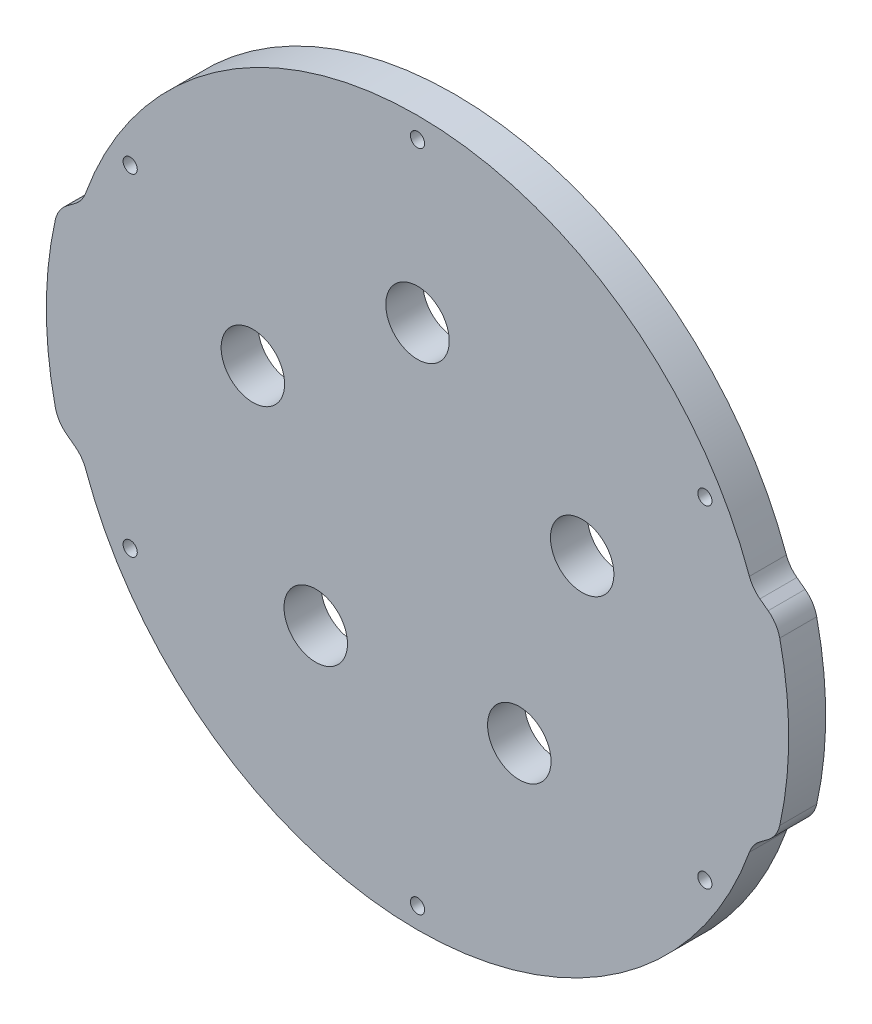
ISO-10303-21;
HEADER;
FILE_DESCRIPTION(('STEP AP214'),'2;1');
FILE_NAME('part.step','',(''),(''),'','','');
FILE_SCHEMA(('AUTOMOTIVE_DESIGN { 1 0 10303 214 1 1 1 1 }'));
ENDSEC;
DATA;
#1=APPLICATION_CONTEXT('core data for automotive mechanical design processes');
#2=APPLICATION_PROTOCOL_DEFINITION('international standard','automotive_design',2000,#1);
#3=PRODUCT_CONTEXT('',#1,'mechanical');
#4=PRODUCT('Part','Part','',(#3));
#5=PRODUCT_RELATED_PRODUCT_CATEGORY('part','',(#4));
#6=PRODUCT_DEFINITION_FORMATION('','',#4);
#7=PRODUCT_DEFINITION_CONTEXT('part definition',#1,'design');
#8=PRODUCT_DEFINITION('design','',#6,#7);
#9=PRODUCT_DEFINITION_SHAPE('','',#8);
#10=(LENGTH_UNIT() NAMED_UNIT(*) SI_UNIT(.MILLI.,.METRE.));
#11=(NAMED_UNIT(*) PLANE_ANGLE_UNIT() SI_UNIT($,.RADIAN.));
#12=(NAMED_UNIT(*) SI_UNIT($,.STERADIAN.) SOLID_ANGLE_UNIT());
#13=UNCERTAINTY_MEASURE_WITH_UNIT(LENGTH_MEASURE(1.E-05),#10,'distance_accuracy_value','');
#14=(GEOMETRIC_REPRESENTATION_CONTEXT(3) GLOBAL_UNCERTAINTY_ASSIGNED_CONTEXT((#13)) GLOBAL_UNIT_ASSIGNED_CONTEXT((#10,
#11,#12)) REPRESENTATION_CONTEXT('',''));
#15=CARTESIAN_POINT('',(0.,0.,0.));
#16=DIRECTION('',(0.,0.,1.));
#17=DIRECTION('',(1.,0.,0.));
#18=AXIS2_PLACEMENT_3D('',#15,#16,#17);
#19=CARTESIAN_POINT('',(0.,0.,5.99999999999999));
#20=DIRECTION('',(0.,0.,1.));
#21=DIRECTION('',(1.,0.,0.));
#22=AXIS2_PLACEMENT_3D('',#19,#20,#21);
#23=PLANE('',#22);
#24=CARTESIAN_POINT('',(-26.7246881078937,8.68337754193633,5.99999999999999));
#25=DIRECTION('',(0.,0.,1.));
#26=DIRECTION('',(1.,0.,0.));
#27=AXIS2_PLACEMENT_3D('',#24,#25,#26);
#28=CIRCLE('',#27,5.15);
#29=CARTESIAN_POINT('',(-21.5746881078937,8.68337754193633,5.99999999999999));
#30=VERTEX_POINT('',#29);
#31=EDGE_CURVE('E354',#30,#30,#28,.T.);
#32=ORIENTED_EDGE('',*,*,#31,.F.);
#33=EDGE_LOOP('',(#32));
#34=FACE_BOUND('',#33,.T.);
#35=CARTESIAN_POINT('',(26.7246881078937,8.68337754193633,5.99999999999999));
#36=DIRECTION('',(0.,0.,1.));
#37=DIRECTION('',(1.,0.,0.));
#38=AXIS2_PLACEMENT_3D('',#35,#36,#37);
#39=CIRCLE('',#38,5.15);
#40=CARTESIAN_POINT('',(31.8746881078937,8.68337754193633,5.99999999999999));
#41=VERTEX_POINT('',#40);
#42=EDGE_CURVE('E348',#41,#41,#39,.T.);
#43=ORIENTED_EDGE('',*,*,#42,.F.);
#44=EDGE_LOOP('',(#43));
#45=FACE_BOUND('',#44,.T.);
#46=CARTESIAN_POINT('',(16.5167655894193,-22.7333775419354,5.99999999999999));
#47=DIRECTION('',(0.,0.,1.));
#48=DIRECTION('',(1.,0.,0.));
#49=AXIS2_PLACEMENT_3D('',#46,#47,#48);
#50=CIRCLE('',#49,5.15000000000171);
#51=CARTESIAN_POINT('',(21.666765589421,-22.7333775419354,5.99999999999999));
#52=VERTEX_POINT('',#51);
#53=EDGE_CURVE('E342',#52,#52,#50,.T.);
#54=ORIENTED_EDGE('',*,*,#53,.F.);
#55=EDGE_LOOP('',(#54));
#56=FACE_BOUND('',#55,.T.);
#57=CARTESIAN_POINT('',(-16.5167655894176,-22.7333775419357,5.99999999999999));
#58=DIRECTION('',(0.,0.,1.));
#59=DIRECTION('',(1.,0.,0.));
#60=AXIS2_PLACEMENT_3D('',#57,#58,#59);
#61=CIRCLE('',#60,5.15000000000128);
#62=CARTESIAN_POINT('',(-11.3667655894163,-22.7333775419357,5.99999999999999));
#63=VERTEX_POINT('',#62);
#64=EDGE_CURVE('E336',#63,#63,#61,.T.);
#65=ORIENTED_EDGE('',*,*,#64,.F.);
#66=EDGE_LOOP('',(#65));
#67=FACE_BOUND('',#66,.T.);
#68=CARTESIAN_POINT('',(0.,28.1,5.99999999999999));
#69=DIRECTION('',(0.,0.,1.));
#70=DIRECTION('',(1.,0.,0.));
#71=AXIS2_PLACEMENT_3D('',#68,#69,#70);
#72=CIRCLE('',#71,5.15);
#73=CARTESIAN_POINT('',(5.15,28.1,5.99999999999999));
#74=VERTEX_POINT('',#73);
#75=EDGE_CURVE('E330',#74,#74,#72,.T.);
#76=ORIENTED_EDGE('',*,*,#75,.F.);
#77=EDGE_LOOP('',(#76));
#78=FACE_BOUND('',#77,.T.);
#79=CARTESIAN_POINT('',(-46.6354679937874,-26.9250000000027,5.99999999999999));
#80=DIRECTION('',(0.,0.,1.));
#81=DIRECTION('',(1.,0.,0.));
#82=AXIS2_PLACEMENT_3D('',#79,#80,#81);
#83=CIRCLE('',#82,1.15000000000566);
#84=CARTESIAN_POINT('',(-45.4854679937818,-26.9250000000027,5.99999999999999));
#85=VERTEX_POINT('',#84);
#86=EDGE_CURVE('E315',#85,#85,#83,.T.);
#87=ORIENTED_EDGE('',*,*,#86,.F.);
#88=EDGE_LOOP('',(#87));
#89=FACE_BOUND('',#88,.T.);
#90=CARTESIAN_POINT('',(46.6354679937966,-26.9249999999973,5.99999999999999));
#91=DIRECTION('',(0.,0.,1.));
#92=DIRECTION('',(1.,0.,0.));
#93=AXIS2_PLACEMENT_3D('',#90,#91,#92);
#94=CIRCLE('',#93,1.15000000000386);
#95=CARTESIAN_POINT('',(47.7854679938005,-26.9249999999973,5.99999999999999));
#96=VERTEX_POINT('',#95);
#97=EDGE_CURVE('E303',#96,#96,#94,.T.);
#98=ORIENTED_EDGE('',*,*,#97,.F.);
#99=EDGE_LOOP('',(#98));
#100=FACE_BOUND('',#99,.T.);
#101=CARTESIAN_POINT('',(0.,53.85,5.99999999999999));
#102=DIRECTION('',(0.,0.,1.));
#103=DIRECTION('',(1.,0.,0.));
#104=AXIS2_PLACEMENT_3D('',#101,#102,#103);
#105=CIRCLE('',#104,1.15);
#106=CARTESIAN_POINT('',(1.15,53.85,5.99999999999999));
#107=VERTEX_POINT('',#106);
#108=EDGE_CURVE('E273',#107,#107,#105,.T.);
#109=ORIENTED_EDGE('',*,*,#108,.F.);
#110=EDGE_LOOP('',(#109));
#111=FACE_BOUND('',#110,.T.);
#112=DIRECTION('',(-0.800447556206134,-0.599402794257441,0.));
#113=VECTOR('',#112,1.);
#114=CARTESIAN_POINT('',(-58.3529133805674,15.,5.99999999999999));
#115=LINE('',#114,#113);
#116=CARTESIAN_POINT('',(-55.5739785892829,17.0809624141399,5.99999999999999));
#117=VERTEX_POINT('',#116);
#118=CARTESIAN_POINT('',(-56.9107570593107,16.0799364955455,5.99999999999999));
#119=VERTEX_POINT('',#118);
#120=EDGE_CURVE('E166',#117,#119,#115,.T.);
#121=ORIENTED_EDGE('',*,*,#120,.T.);
#122=CARTESIAN_POINT('',(-53.9137430880235,12.0776987145149,5.99999999999999));
#123=DIRECTION('',(0.,0.,1.));
#124=DIRECTION('',(1.,0.,0.));
#125=AXIS2_PLACEMENT_3D('',#122,#123,#124);
#126=CIRCLE('',#125,5.);
#127=CARTESIAN_POINT('',(-58.7928148606954,13.1707031230683,5.99999999999999));
#128=VERTEX_POINT('',#127);
#129=EDGE_CURVE('E208',#119,#128,#126,.T.);
#130=ORIENTED_EDGE('',*,*,#129,.T.);
#131=CARTESIAN_POINT('',(0.,0.,5.99999999999999));
#132=DIRECTION('',(0.,0.,1.));
#133=DIRECTION('',(1.,0.,0.));
#134=AXIS2_PLACEMENT_3D('',#131,#132,#133);
#135=CIRCLE('',#134,60.25);
#136=CARTESIAN_POINT('',(-58.7928148606953,-13.1707031230683,5.99999999999999));
#137=VERTEX_POINT('',#136);
#138=EDGE_CURVE('E261',#128,#137,#135,.T.);
#139=ORIENTED_EDGE('',*,*,#138,.T.);
#140=CARTESIAN_POINT('',(-53.9137430880235,-12.0776987145149,5.99999999999999));
#141=DIRECTION('',(0.,0.,1.));
#142=DIRECTION('',(1.,0.,0.));
#143=AXIS2_PLACEMENT_3D('',#140,#141,#142);
#144=CIRCLE('',#143,5.);
#145=CARTESIAN_POINT('',(-56.9107570593107,-16.0799364955456,5.99999999999999));
#146=VERTEX_POINT('',#145);
#147=EDGE_CURVE('E54',#137,#146,#144,.T.);
#148=ORIENTED_EDGE('',*,*,#147,.T.);
#149=DIRECTION('',(0.800447556206134,-0.599402794257441,0.));
#150=VECTOR('',#149,1.);
#151=CARTESIAN_POINT('',(-58.3529133805674,-15.,5.99999999999999));
#152=LINE('',#151,#150);
#153=CARTESIAN_POINT('',(-55.5739785892829,-17.08096241414,5.99999999999999));
#154=VERTEX_POINT('',#153);
#155=EDGE_CURVE('E186',#146,#154,#152,.T.);
#156=ORIENTED_EDGE('',*,*,#155,.T.);
#157=CARTESIAN_POINT('',(-58.5709925605701,-21.0832001951707,5.99999999999999));
#158=DIRECTION('',(0.,0.,1.));
#159=DIRECTION('',(1.,0.,0.));
#160=AXIS2_PLACEMENT_3D('',#157,#158,#159);
#161=CIRCLE('',#160,5.);
#162=CARTESIAN_POINT('',(-53.8664951661468,-19.3897704606188,5.99999999999999));
#163=VERTEX_POINT('',#162);
#164=EDGE_CURVE('E236',#154,#163,#161,.F.);
#165=ORIENTED_EDGE('',*,*,#164,.T.);
#166=CARTESIAN_POINT('',(0.,0.,5.99999999999999));
#167=DIRECTION('',(0.,0.,1.));
#168=DIRECTION('',(1.,0.,0.));
#169=AXIS2_PLACEMENT_3D('',#166,#167,#168);
#170=CIRCLE('',#169,57.25);
#171=CARTESIAN_POINT('',(53.8664951661468,-19.3897704606188,5.99999999999999));
#172=VERTEX_POINT('',#171);
#173=EDGE_CURVE('E185',#163,#172,#170,.T.);
#174=ORIENTED_EDGE('',*,*,#173,.T.);
#175=CARTESIAN_POINT('',(58.5709925605701,-21.0832001951706,5.99999999999999));
#176=DIRECTION('',(0.,0.,1.));
#177=DIRECTION('',(1.,0.,0.));
#178=AXIS2_PLACEMENT_3D('',#175,#176,#177);
#179=CIRCLE('',#178,5.);
#180=CARTESIAN_POINT('',(55.5739785892829,-17.0809624141399,5.99999999999999));
#181=VERTEX_POINT('',#180);
#182=EDGE_CURVE('E240',#172,#181,#179,.F.);
#183=ORIENTED_EDGE('',*,*,#182,.T.);
#184=DIRECTION('',(0.800447556206134,0.599402794257441,0.));
#185=VECTOR('',#184,1.);
#186=CARTESIAN_POINT('',(54.3466880315627,-18.,5.99999999999999));
#187=LINE('',#186,#185);
#188=CARTESIAN_POINT('',(56.9107570593107,-16.0799364955456,5.99999999999999));
#189=VERTEX_POINT('',#188);
#190=EDGE_CURVE('E289',#181,#189,#187,.T.);
#191=ORIENTED_EDGE('',*,*,#190,.T.);
#192=CARTESIAN_POINT('',(53.9137430880235,-12.0776987145149,5.99999999999999));
#193=DIRECTION('',(0.,0.,1.));
#194=DIRECTION('',(1.,0.,0.));
#195=AXIS2_PLACEMENT_3D('',#192,#193,#194);
#196=CIRCLE('',#195,5.);
#197=CARTESIAN_POINT('',(58.7928148606953,-13.1707031230683,5.99999999999999));
#198=VERTEX_POINT('',#197);
#199=EDGE_CURVE('E205',#189,#198,#196,.T.);
#200=ORIENTED_EDGE('',*,*,#199,.T.);
#201=CARTESIAN_POINT('',(0.,0.,5.99999999999999));
#202=DIRECTION('',(0.,0.,1.));
#203=DIRECTION('',(-1.,0.,0.));
#204=AXIS2_PLACEMENT_3D('',#201,#202,#203);
#205=CIRCLE('',#204,60.2500000000001);
#206=CARTESIAN_POINT('',(58.7928148606953,13.1707031230683,5.99999999999999));
#207=VERTEX_POINT('',#206);
#208=EDGE_CURVE('E263',#198,#207,#205,.T.);
#209=ORIENTED_EDGE('',*,*,#208,.T.);
#210=CARTESIAN_POINT('',(53.9137430880235,12.0776987145149,5.99999999999999));
#211=DIRECTION('',(0.,0.,1.));
#212=DIRECTION('',(1.,0.,0.));
#213=AXIS2_PLACEMENT_3D('',#210,#211,#212);
#214=CIRCLE('',#213,5.);
#215=CARTESIAN_POINT('',(56.9107570593107,16.0799364955455,5.99999999999999));
#216=VERTEX_POINT('',#215);
#217=EDGE_CURVE('E203',#207,#216,#214,.T.);
#218=ORIENTED_EDGE('',*,*,#217,.T.);
#219=DIRECTION('',(-0.800447556206134,0.599402794257441,0.));
#220=VECTOR('',#219,1.);
#221=CARTESIAN_POINT('',(58.3529133805674,15.,5.99999999999999));
#222=LINE('',#221,#220);
#223=CARTESIAN_POINT('',(55.5739785892829,17.0809624141399,5.99999999999999));
#224=VERTEX_POINT('',#223);
#225=EDGE_CURVE('E257',#216,#224,#222,.T.);
#226=ORIENTED_EDGE('',*,*,#225,.T.);
#227=CARTESIAN_POINT('',(58.5709925605701,21.0832001951706,5.99999999999999));
#228=DIRECTION('',(0.,0.,1.));
#229=DIRECTION('',(1.,0.,0.));
#230=AXIS2_PLACEMENT_3D('',#227,#228,#229);
#231=CIRCLE('',#230,5.);
#232=CARTESIAN_POINT('',(53.8664951661468,19.3897704606188,5.99999999999999));
#233=VERTEX_POINT('',#232);
#234=EDGE_CURVE('E11',#224,#233,#231,.F.);
#235=ORIENTED_EDGE('',*,*,#234,.T.);
#236=CARTESIAN_POINT('',(0.,0.,5.99999999999999));
#237=DIRECTION('',(0.,0.,1.));
#238=DIRECTION('',(-1.,0.,0.));
#239=AXIS2_PLACEMENT_3D('',#236,#237,#238);
#240=CIRCLE('',#239,57.25);
#241=CARTESIAN_POINT('',(-53.8664951661468,19.3897704606188,5.99999999999999));
#242=VERTEX_POINT('',#241);
#243=EDGE_CURVE('E256',#233,#242,#240,.T.);
#244=ORIENTED_EDGE('',*,*,#243,.T.);
#245=CARTESIAN_POINT('',(-58.5709925605701,21.0832001951706,5.99999999999999));
#246=DIRECTION('',(0.,0.,1.));
#247=DIRECTION('',(1.,0.,0.));
#248=AXIS2_PLACEMENT_3D('',#245,#246,#247);
#249=CIRCLE('',#248,5.);
#250=EDGE_CURVE('E156',#242,#117,#249,.F.);
#251=ORIENTED_EDGE('',*,*,#250,.T.);
#252=EDGE_LOOP('',(#121,#130,#139,#148,#156,#165,#174,#183,#191,#200,#209,#218,#226,#235,#244,#251));
#253=FACE_BOUND('',#252,.T.);
#254=CARTESIAN_POINT('',(46.6354679937935,26.9250000000027,5.99999999999999));
#255=DIRECTION('',(0.,0.,1.));
#256=DIRECTION('',(1.,0.,0.));
#257=AXIS2_PLACEMENT_3D('',#254,#255,#256);
#258=CIRCLE('',#257,1.15000000000082);
#259=CARTESIAN_POINT('',(47.7854679937944,26.9250000000027,5.99999999999999));
#260=VERTEX_POINT('',#259);
#261=EDGE_CURVE('E297',#260,#260,#258,.T.);
#262=ORIENTED_EDGE('',*,*,#261,.F.);
#263=EDGE_LOOP('',(#262));
#264=FACE_BOUND('',#263,.T.);
#265=CARTESIAN_POINT('',(6.10882872065233E-12,-53.85,5.99999999999999));
#266=DIRECTION('',(0.,0.,1.));
#267=DIRECTION('',(1.,0.,0.));
#268=AXIS2_PLACEMENT_3D('',#265,#266,#267);
#269=CIRCLE('',#268,1.1500000000062);
#270=CARTESIAN_POINT('',(1.15000000001231,-53.85,5.99999999999999));
#271=VERTEX_POINT('',#270);
#272=EDGE_CURVE('E309',#271,#271,#269,.T.);
#273=ORIENTED_EDGE('',*,*,#272,.F.);
#274=EDGE_LOOP('',(#273));
#275=FACE_BOUND('',#274,.T.);
#276=CARTESIAN_POINT('',(-46.6354679937905,26.9249999999973,5.99999999999999));
#277=DIRECTION('',(0.,0.,1.));
#278=DIRECTION('',(1.,0.,0.));
#279=AXIS2_PLACEMENT_3D('',#276,#277,#278);
#280=CIRCLE('',#279,1.15000000000287);
#281=CARTESIAN_POINT('',(-45.4854679937876,26.9249999999973,5.99999999999999));
#282=VERTEX_POINT('',#281);
#283=EDGE_CURVE('E321',#282,#282,#280,.T.);
#284=ORIENTED_EDGE('',*,*,#283,.F.);
#285=EDGE_LOOP('',(#284));
#286=FACE_BOUND('',#285,.T.);
#287=ADVANCED_FACE('F32',(#34,#45,#56,#67,#78,#89,#100,#111,#253,#264,#275,#286),#23,.T.);
#288=CARTESIAN_POINT('',(0.,0.,0.));
#289=DIRECTION('',(0.,0.,1.));
#290=DIRECTION('',(1.,0.,0.));
#291=AXIS2_PLACEMENT_3D('',#288,#289,#290);
#292=PLANE('',#291);
#293=CARTESIAN_POINT('',(-26.7246881078937,8.68337754193633,0.));
#294=DIRECTION('',(0.,0.,1.));
#295=DIRECTION('',(1.,0.,0.));
#296=AXIS2_PLACEMENT_3D('',#293,#294,#295);
#297=CIRCLE('',#296,5.15);
#298=CARTESIAN_POINT('',(-21.5746881078937,8.68337754193633,0.));
#299=VERTEX_POINT('',#298);
#300=EDGE_CURVE('E333',#299,#299,#297,.T.);
#301=ORIENTED_EDGE('',*,*,#300,.T.);
#302=EDGE_LOOP('',(#301));
#303=FACE_BOUND('',#302,.T.);
#304=CARTESIAN_POINT('',(26.7246881078937,8.68337754193633,0.));
#305=DIRECTION('',(0.,0.,1.));
#306=DIRECTION('',(1.,0.,0.));
#307=AXIS2_PLACEMENT_3D('',#304,#305,#306);
#308=CIRCLE('',#307,5.15);
#309=CARTESIAN_POINT('',(31.8746881078937,8.68337754193633,0.));
#310=VERTEX_POINT('',#309);
#311=EDGE_CURVE('E351',#310,#310,#308,.T.);
#312=ORIENTED_EDGE('',*,*,#311,.T.);
#313=EDGE_LOOP('',(#312));
#314=FACE_BOUND('',#313,.T.);
#315=CARTESIAN_POINT('',(16.5167655894193,-22.7333775419354,0.));
#316=DIRECTION('',(0.,0.,1.));
#317=DIRECTION('',(1.,0.,0.));
#318=AXIS2_PLACEMENT_3D('',#315,#316,#317);
#319=CIRCLE('',#318,5.15000000000171);
#320=CARTESIAN_POINT('',(21.666765589421,-22.7333775419354,0.));
#321=VERTEX_POINT('',#320);
#322=EDGE_CURVE('E345',#321,#321,#319,.T.);
#323=ORIENTED_EDGE('',*,*,#322,.T.);
#324=EDGE_LOOP('',(#323));
#325=FACE_BOUND('',#324,.T.);
#326=CARTESIAN_POINT('',(-16.5167655894176,-22.7333775419357,0.));
#327=DIRECTION('',(0.,0.,1.));
#328=DIRECTION('',(1.,0.,0.));
#329=AXIS2_PLACEMENT_3D('',#326,#327,#328);
#330=CIRCLE('',#329,5.15000000000128);
#331=CARTESIAN_POINT('',(-11.3667655894163,-22.7333775419357,0.));
#332=VERTEX_POINT('',#331);
#333=EDGE_CURVE('E339',#332,#332,#330,.T.);
#334=ORIENTED_EDGE('',*,*,#333,.T.);
#335=EDGE_LOOP('',(#334));
#336=FACE_BOUND('',#335,.T.);
#337=CARTESIAN_POINT('',(0.,28.1,0.));
#338=DIRECTION('',(0.,0.,1.));
#339=DIRECTION('',(1.,0.,0.));
#340=AXIS2_PLACEMENT_3D('',#337,#338,#339);
#341=CIRCLE('',#340,5.15);
#342=CARTESIAN_POINT('',(5.15,28.1,0.));
#343=VERTEX_POINT('',#342);
#344=EDGE_CURVE('E327',#343,#343,#341,.T.);
#345=ORIENTED_EDGE('',*,*,#344,.T.);
#346=EDGE_LOOP('',(#345));
#347=FACE_BOUND('',#346,.T.);
#348=CARTESIAN_POINT('',(0.,0.,0.));
#349=DIRECTION('',(0.,0.,1.));
#350=DIRECTION('',(1.,0.,0.));
#351=AXIS2_PLACEMENT_3D('',#348,#349,#350);
#352=CIRCLE('',#351,60.25);
#353=CARTESIAN_POINT('',(-58.7928148606954,13.1707031230683,0.));
#354=VERTEX_POINT('',#353);
#355=CARTESIAN_POINT('',(-58.7928148606953,-13.1707031230683,0.));
#356=VERTEX_POINT('',#355);
#357=EDGE_CURVE('E174',#354,#356,#352,.T.);
#358=ORIENTED_EDGE('',*,*,#357,.F.);
#359=CARTESIAN_POINT('',(-53.9137430880235,12.0776987145149,0.));
#360=DIRECTION('',(0.,0.,1.));
#361=DIRECTION('',(1.,0.,0.));
#362=AXIS2_PLACEMENT_3D('',#359,#360,#361);
#363=CIRCLE('',#362,5.);
#364=CARTESIAN_POINT('',(-56.9107570593107,16.0799364955455,0.));
#365=VERTEX_POINT('',#364);
#366=EDGE_CURVE('E173',#354,#365,#363,.F.);
#367=ORIENTED_EDGE('',*,*,#366,.T.);
#368=DIRECTION('',(-0.800447556206134,-0.599402794257441,0.));
#369=VECTOR('',#368,1.);
#370=CARTESIAN_POINT('',(-58.3529133805674,15.,0.));
#371=LINE('',#370,#369);
#372=CARTESIAN_POINT('',(-55.5739785892829,17.0809624141399,0.));
#373=VERTEX_POINT('',#372);
#374=EDGE_CURVE('E163',#373,#365,#371,.T.);
#375=ORIENTED_EDGE('',*,*,#374,.F.);
#376=CARTESIAN_POINT('',(-58.5709925605701,21.0832001951706,0.));
#377=DIRECTION('',(0.,0.,1.));
#378=DIRECTION('',(1.,0.,0.));
#379=AXIS2_PLACEMENT_3D('',#376,#377,#378);
#380=CIRCLE('',#379,5.);
#381=CARTESIAN_POINT('',(-53.8664951661468,19.3897704606188,0.));
#382=VERTEX_POINT('',#381);
#383=EDGE_CURVE('E146',#373,#382,#380,.T.);
#384=ORIENTED_EDGE('',*,*,#383,.T.);
#385=CARTESIAN_POINT('',(0.,0.,0.));
#386=DIRECTION('',(0.,0.,1.));
#387=DIRECTION('',(-1.,0.,0.));
#388=AXIS2_PLACEMENT_3D('',#385,#386,#387);
#389=CIRCLE('',#388,57.25);
#390=CARTESIAN_POINT('',(53.8664951661468,19.3897704606188,0.));
#391=VERTEX_POINT('',#390);
#392=EDGE_CURVE('E175',#391,#382,#389,.T.);
#393=ORIENTED_EDGE('',*,*,#392,.F.);
#394=CARTESIAN_POINT('',(58.5709925605701,21.0832001951706,0.));
#395=DIRECTION('',(0.,0.,1.));
#396=DIRECTION('',(1.,0.,0.));
#397=AXIS2_PLACEMENT_3D('',#394,#395,#396);
#398=CIRCLE('',#397,5.);
#399=CARTESIAN_POINT('',(55.5739785892829,17.0809624141399,0.));
#400=VERTEX_POINT('',#399);
#401=EDGE_CURVE('E40',#391,#400,#398,.T.);
#402=ORIENTED_EDGE('',*,*,#401,.T.);
#403=DIRECTION('',(-0.800447556206134,0.599402794257441,0.));
#404=VECTOR('',#403,1.);
#405=CARTESIAN_POINT('',(58.3529133805674,15.,0.));
#406=LINE('',#405,#404);
#407=CARTESIAN_POINT('',(56.9107570593107,16.0799364955455,0.));
#408=VERTEX_POINT('',#407);
#409=EDGE_CURVE('E180',#408,#400,#406,.T.);
#410=ORIENTED_EDGE('',*,*,#409,.F.);
#411=CARTESIAN_POINT('',(53.9137430880235,12.0776987145149,0.));
#412=DIRECTION('',(0.,0.,1.));
#413=DIRECTION('',(1.,0.,0.));
#414=AXIS2_PLACEMENT_3D('',#411,#412,#413);
#415=CIRCLE('',#414,5.);
#416=CARTESIAN_POINT('',(58.7928148606953,13.1707031230683,0.));
#417=VERTEX_POINT('',#416);
#418=EDGE_CURVE('E196',#408,#417,#415,.F.);
#419=ORIENTED_EDGE('',*,*,#418,.T.);
#420=CARTESIAN_POINT('',(0.,0.,0.));
#421=DIRECTION('',(0.,0.,1.));
#422=DIRECTION('',(-1.,0.,0.));
#423=AXIS2_PLACEMENT_3D('',#420,#421,#422);
#424=CIRCLE('',#423,60.2500000000001);
#425=CARTESIAN_POINT('',(58.7928148606953,-13.1707031230683,0.));
#426=VERTEX_POINT('',#425);
#427=EDGE_CURVE('E251',#426,#417,#424,.T.);
#428=ORIENTED_EDGE('',*,*,#427,.F.);
#429=CARTESIAN_POINT('',(53.9137430880235,-12.0776987145149,0.));
#430=DIRECTION('',(0.,0.,1.));
#431=DIRECTION('',(1.,0.,0.));
#432=AXIS2_PLACEMENT_3D('',#429,#430,#431);
#433=CIRCLE('',#432,5.);
#434=CARTESIAN_POINT('',(56.9107570593107,-16.0799364955456,0.));
#435=VERTEX_POINT('',#434);
#436=EDGE_CURVE('E198',#426,#435,#433,.F.);
#437=ORIENTED_EDGE('',*,*,#436,.T.);
#438=DIRECTION('',(0.800447556206134,0.599402794257441,0.));
#439=VECTOR('',#438,1.);
#440=CARTESIAN_POINT('',(54.3466880315627,-18.,0.));
#441=LINE('',#440,#439);
#442=CARTESIAN_POINT('',(55.5739785892829,-17.0809624141399,0.));
#443=VERTEX_POINT('',#442);
#444=EDGE_CURVE('E272',#443,#435,#441,.T.);
#445=ORIENTED_EDGE('',*,*,#444,.F.);
#446=CARTESIAN_POINT('',(58.5709925605701,-21.0832001951706,0.));
#447=DIRECTION('',(0.,0.,1.));
#448=DIRECTION('',(1.,0.,0.));
#449=AXIS2_PLACEMENT_3D('',#446,#447,#448);
#450=CIRCLE('',#449,5.);
#451=CARTESIAN_POINT('',(53.8664951661468,-19.3897704606188,0.));
#452=VERTEX_POINT('',#451);
#453=EDGE_CURVE('E238',#443,#452,#450,.T.);
#454=ORIENTED_EDGE('',*,*,#453,.T.);
#455=CARTESIAN_POINT('',(0.,0.,0.));
#456=DIRECTION('',(0.,0.,1.));
#457=DIRECTION('',(1.,0.,0.));
#458=AXIS2_PLACEMENT_3D('',#455,#456,#457);
#459=CIRCLE('',#458,57.25);
#460=CARTESIAN_POINT('',(-53.8664951661468,-19.3897704606188,0.));
#461=VERTEX_POINT('',#460);
#462=EDGE_CURVE('E269',#461,#452,#459,.T.);
#463=ORIENTED_EDGE('',*,*,#462,.F.);
#464=CARTESIAN_POINT('',(-58.5709925605701,-21.0832001951707,0.));
#465=DIRECTION('',(0.,0.,1.));
#466=DIRECTION('',(1.,0.,0.));
#467=AXIS2_PLACEMENT_3D('',#464,#465,#466);
#468=CIRCLE('',#467,5.);
#469=CARTESIAN_POINT('',(-55.5739785892829,-17.08096241414,0.));
#470=VERTEX_POINT('',#469);
#471=EDGE_CURVE('E234',#461,#470,#468,.T.);
#472=ORIENTED_EDGE('',*,*,#471,.T.);
#473=DIRECTION('',(0.800447556206134,-0.599402794257441,0.));
#474=VECTOR('',#473,1.);
#475=CARTESIAN_POINT('',(-58.3529133805674,-15.,0.));
#476=LINE('',#475,#474);
#477=CARTESIAN_POINT('',(-56.9107570593107,-16.0799364955456,0.));
#478=VERTEX_POINT('',#477);
#479=EDGE_CURVE('E178',#478,#470,#476,.T.);
#480=ORIENTED_EDGE('',*,*,#479,.F.);
#481=CARTESIAN_POINT('',(-53.9137430880235,-12.0776987145149,0.));
#482=DIRECTION('',(0.,0.,1.));
#483=DIRECTION('',(1.,0.,0.));
#484=AXIS2_PLACEMENT_3D('',#481,#482,#483);
#485=CIRCLE('',#484,5.);
#486=EDGE_CURVE('E200',#478,#356,#485,.F.);
#487=ORIENTED_EDGE('',*,*,#486,.T.);
#488=EDGE_LOOP('',(#358,#367,#375,#384,#393,#402,#410,#419,#428,#437,#445,#454,#463,#472,#480,#487));
#489=FACE_BOUND('',#488,.T.);
#490=CARTESIAN_POINT('',(0.,53.85,0.));
#491=DIRECTION('',(0.,0.,1.));
#492=DIRECTION('',(1.,0.,0.));
#493=AXIS2_PLACEMENT_3D('',#490,#491,#492);
#494=CIRCLE('',#493,1.15);
#495=CARTESIAN_POINT('',(1.15,53.85,0.));
#496=VERTEX_POINT('',#495);
#497=EDGE_CURVE('E294',#496,#496,#494,.T.);
#498=ORIENTED_EDGE('',*,*,#497,.T.);
#499=EDGE_LOOP('',(#498));
#500=FACE_BOUND('',#499,.T.);
#501=CARTESIAN_POINT('',(46.6354679937935,26.9250000000027,0.));
#502=DIRECTION('',(0.,0.,1.));
#503=DIRECTION('',(1.,0.,0.));
#504=AXIS2_PLACEMENT_3D('',#501,#502,#503);
#505=CIRCLE('',#504,1.15000000000082);
#506=CARTESIAN_POINT('',(47.7854679937944,26.9250000000027,0.));
#507=VERTEX_POINT('',#506);
#508=EDGE_CURVE('E300',#507,#507,#505,.T.);
#509=ORIENTED_EDGE('',*,*,#508,.T.);
#510=EDGE_LOOP('',(#509));
#511=FACE_BOUND('',#510,.T.);
#512=CARTESIAN_POINT('',(46.6354679937966,-26.9249999999973,0.));
#513=DIRECTION('',(0.,0.,1.));
#514=DIRECTION('',(1.,0.,0.));
#515=AXIS2_PLACEMENT_3D('',#512,#513,#514);
#516=CIRCLE('',#515,1.15000000000386);
#517=CARTESIAN_POINT('',(47.7854679938005,-26.9249999999973,0.));
#518=VERTEX_POINT('',#517);
#519=EDGE_CURVE('E306',#518,#518,#516,.T.);
#520=ORIENTED_EDGE('',*,*,#519,.T.);
#521=EDGE_LOOP('',(#520));
#522=FACE_BOUND('',#521,.T.);
#523=CARTESIAN_POINT('',(6.10882872065233E-12,-53.85,0.));
#524=DIRECTION('',(0.,0.,1.));
#525=DIRECTION('',(1.,0.,0.));
#526=AXIS2_PLACEMENT_3D('',#523,#524,#525);
#527=CIRCLE('',#526,1.1500000000062);
#528=CARTESIAN_POINT('',(1.15000000001231,-53.85,0.));
#529=VERTEX_POINT('',#528);
#530=EDGE_CURVE('E312',#529,#529,#527,.T.);
#531=ORIENTED_EDGE('',*,*,#530,.T.);
#532=EDGE_LOOP('',(#531));
#533=FACE_BOUND('',#532,.T.);
#534=CARTESIAN_POINT('',(-46.6354679937874,-26.9250000000027,0.));
#535=DIRECTION('',(0.,0.,1.));
#536=DIRECTION('',(1.,0.,0.));
#537=AXIS2_PLACEMENT_3D('',#534,#535,#536);
#538=CIRCLE('',#537,1.15000000000566);
#539=CARTESIAN_POINT('',(-45.4854679937818,-26.9250000000027,0.));
#540=VERTEX_POINT('',#539);
#541=EDGE_CURVE('E318',#540,#540,#538,.T.);
#542=ORIENTED_EDGE('',*,*,#541,.T.);
#543=EDGE_LOOP('',(#542));
#544=FACE_BOUND('',#543,.T.);
#545=CARTESIAN_POINT('',(-46.6354679937905,26.9249999999973,0.));
#546=DIRECTION('',(0.,0.,1.));
#547=DIRECTION('',(1.,0.,0.));
#548=AXIS2_PLACEMENT_3D('',#545,#546,#547);
#549=CIRCLE('',#548,1.15000000000287);
#550=CARTESIAN_POINT('',(-45.4854679937876,26.9249999999973,0.));
#551=VERTEX_POINT('',#550);
#552=EDGE_CURVE('E324',#551,#551,#549,.T.);
#553=ORIENTED_EDGE('',*,*,#552,.T.);
#554=EDGE_LOOP('',(#553));
#555=FACE_BOUND('',#554,.T.);
#556=ADVANCED_FACE('F171',(#303,#314,#325,#336,#347,#489,#500,#511,#522,#533,#544,#555),#292,.F.);
#557=CARTESIAN_POINT('',(0.,0.,5.99999999999999));
#558=DIRECTION('',(0.,0.,-1.));
#559=DIRECTION('',(-1.,0.,0.));
#560=AXIS2_PLACEMENT_3D('',#557,#558,#559);
#561=CYLINDRICAL_SURFACE('',#560,57.25);
#562=ORIENTED_EDGE('',*,*,#173,.F.);
#563=DIRECTION('',(0.,0.,-1.));
#564=VECTOR('',#563,1.);
#565=CARTESIAN_POINT('',(-53.8664951661468,-19.3897704606188,5.99999999999999));
#566=LINE('',#565,#564);
#567=EDGE_CURVE('E216',#163,#461,#566,.T.);
#568=ORIENTED_EDGE('',*,*,#567,.T.);
#569=ORIENTED_EDGE('',*,*,#462,.T.);
#570=DIRECTION('',(0.,0.,-1.));
#571=VECTOR('',#570,1.);
#572=CARTESIAN_POINT('',(53.8664951661468,-19.3897704606188,5.99999999999999));
#573=LINE('',#572,#571);
#574=EDGE_CURVE('E214',#452,#172,#573,.F.);
#575=ORIENTED_EDGE('',*,*,#574,.T.);
#576=EDGE_LOOP('',(#562,#568,#569,#575));
#577=FACE_BOUND('',#576,.T.);
#578=ADVANCED_FACE('F395',(#577),#561,.T.);
#579=CARTESIAN_POINT('',(54.3466880315627,-18.,5.99999999999999));
#580=DIRECTION('',(-0.599402794257441,0.800447556206134,0.));
#581=DIRECTION('',(-0.800447556206134,-0.599402794257441,0.));
#582=AXIS2_PLACEMENT_3D('',#579,#580,#581);
#583=PLANE('',#582);
#584=ORIENTED_EDGE('',*,*,#190,.F.);
#585=DIRECTION('',(0.,0.,1.));
#586=VECTOR('',#585,1.);
#587=CARTESIAN_POINT('',(55.5739785892829,-17.0809624141399,0.));
#588=LINE('',#587,#586);
#589=EDGE_CURVE('E221',#181,#443,#588,.F.);
#590=ORIENTED_EDGE('',*,*,#589,.T.);
#591=ORIENTED_EDGE('',*,*,#444,.T.);
#592=DIRECTION('',(0.,0.,-1.));
#593=VECTOR('',#592,1.);
#594=CARTESIAN_POINT('',(56.9107570593107,-16.0799364955456,5.99999999999999));
#595=LINE('',#594,#593);
#596=EDGE_CURVE('E219',#435,#189,#595,.F.);
#597=ORIENTED_EDGE('',*,*,#596,.T.);
#598=EDGE_LOOP('',(#584,#590,#591,#597));
#599=FACE_BOUND('',#598,.T.);
#600=ADVANCED_FACE('F449',(#599),#583,.F.);
#601=CARTESIAN_POINT('',(0.,0.,5.99999999999999));
#602=DIRECTION('',(0.,0.,-1.));
#603=DIRECTION('',(-1.,0.,0.));
#604=AXIS2_PLACEMENT_3D('',#601,#602,#603);
#605=CYLINDRICAL_SURFACE('',#604,60.2500000000001);
#606=ORIENTED_EDGE('',*,*,#208,.F.);
#607=DIRECTION('',(0.,0.,-1.));
#608=VECTOR('',#607,1.);
#609=CARTESIAN_POINT('',(58.7928148606953,-13.1707031230683,5.99999999999999));
#610=LINE('',#609,#608);
#611=EDGE_CURVE('E226',#198,#426,#610,.T.);
#612=ORIENTED_EDGE('',*,*,#611,.T.);
#613=ORIENTED_EDGE('',*,*,#427,.T.);
#614=DIRECTION('',(0.,0.,-1.));
#615=VECTOR('',#614,1.);
#616=CARTESIAN_POINT('',(58.7928148606953,13.1707031230683,5.99999999999999));
#617=LINE('',#616,#615);
#618=EDGE_CURVE('E224',#417,#207,#617,.F.);
#619=ORIENTED_EDGE('',*,*,#618,.T.);
#620=EDGE_LOOP('',(#606,#612,#613,#619));
#621=FACE_BOUND('',#620,.T.);
#622=ADVANCED_FACE('F281',(#621),#605,.T.);
#623=CARTESIAN_POINT('',(58.3529133805674,15.,5.99999999999999));
#624=DIRECTION('',(-0.599402794257441,-0.800447556206134,0.));
#625=DIRECTION('',(0.800447556206134,-0.599402794257441,0.));
#626=AXIS2_PLACEMENT_3D('',#623,#624,#625);
#627=PLANE('',#626);
#628=ORIENTED_EDGE('',*,*,#225,.F.);
#629=DIRECTION('',(0.,0.,-1.));
#630=VECTOR('',#629,1.);
#631=CARTESIAN_POINT('',(56.9107570593107,16.0799364955455,5.99999999999999));
#632=LINE('',#631,#630);
#633=EDGE_CURVE('E157',#216,#408,#632,.T.);
#634=ORIENTED_EDGE('',*,*,#633,.T.);
#635=ORIENTED_EDGE('',*,*,#409,.T.);
#636=DIRECTION('',(0.,0.,1.));
#637=VECTOR('',#636,1.);
#638=CARTESIAN_POINT('',(55.5739785892829,17.0809624141399,5.99999999999999));
#639=LINE('',#638,#637);
#640=EDGE_CURVE('E229',#400,#224,#639,.T.);
#641=ORIENTED_EDGE('',*,*,#640,.T.);
#642=EDGE_LOOP('',(#628,#634,#635,#641));
#643=FACE_BOUND('',#642,.T.);
#644=ADVANCED_FACE('F248',(#643),#627,.F.);
#645=CARTESIAN_POINT('',(0.,0.,5.99999999999999));
#646=DIRECTION('',(0.,0.,-1.));
#647=DIRECTION('',(-1.,0.,0.));
#648=AXIS2_PLACEMENT_3D('',#645,#646,#647);
#649=CYLINDRICAL_SURFACE('',#648,57.25);
#650=ORIENTED_EDGE('',*,*,#392,.T.);
#651=DIRECTION('',(0.,0.,-1.));
#652=VECTOR('',#651,1.);
#653=CARTESIAN_POINT('',(-53.8664951661468,19.3897704606188,5.99999999999999));
#654=LINE('',#653,#652);
#655=EDGE_CURVE('E151',#382,#242,#654,.F.);
#656=ORIENTED_EDGE('',*,*,#655,.T.);
#657=ORIENTED_EDGE('',*,*,#243,.F.);
#658=DIRECTION('',(0.,0.,-1.));
#659=VECTOR('',#658,1.);
#660=CARTESIAN_POINT('',(53.8664951661468,19.3897704606188,5.99999999999999));
#661=LINE('',#660,#659);
#662=EDGE_CURVE('E167',#233,#391,#661,.T.);
#663=ORIENTED_EDGE('',*,*,#662,.T.);
#664=EDGE_LOOP('',(#650,#656,#657,#663));
#665=FACE_BOUND('',#664,.T.);
#666=ADVANCED_FACE('F259',(#665),#649,.T.);
#667=CARTESIAN_POINT('',(-58.3529133805674,15.,5.99999999999999));
#668=DIRECTION('',(0.599402794257441,-0.800447556206134,0.));
#669=DIRECTION('',(0.800447556206134,0.599402794257441,0.));
#670=AXIS2_PLACEMENT_3D('',#667,#668,#669);
#671=PLANE('',#670);
#672=ORIENTED_EDGE('',*,*,#120,.F.);
#673=DIRECTION('',(0.,0.,1.));
#674=VECTOR('',#673,1.);
#675=CARTESIAN_POINT('',(-55.5739785892829,17.0809624141399,0.));
#676=LINE('',#675,#674);
#677=EDGE_CURVE('E150',#117,#373,#676,.F.);
#678=ORIENTED_EDGE('',*,*,#677,.T.);
#679=ORIENTED_EDGE('',*,*,#374,.T.);
#680=DIRECTION('',(0.,0.,-1.));
#681=VECTOR('',#680,1.);
#682=CARTESIAN_POINT('',(-56.9107570593107,16.0799364955455,5.99999999999999));
#683=LINE('',#682,#681);
#684=EDGE_CURVE('E168',#365,#119,#683,.F.);
#685=ORIENTED_EDGE('',*,*,#684,.T.);
#686=EDGE_LOOP('',(#672,#678,#679,#685));
#687=FACE_BOUND('',#686,.T.);
#688=ADVANCED_FACE('F162',(#687),#671,.F.);
#689=CARTESIAN_POINT('',(0.,0.,5.99999999999999));
#690=DIRECTION('',(0.,0.,-1.));
#691=DIRECTION('',(-1.,0.,0.));
#692=AXIS2_PLACEMENT_3D('',#689,#690,#691);
#693=CYLINDRICAL_SURFACE('',#692,60.25);
#694=ORIENTED_EDGE('',*,*,#138,.F.);
#695=DIRECTION('',(0.,0.,-1.));
#696=VECTOR('',#695,1.);
#697=CARTESIAN_POINT('',(-58.7928148606954,13.1707031230683,5.99999999999999));
#698=LINE('',#697,#696);
#699=EDGE_CURVE('E193',#128,#354,#698,.T.);
#700=ORIENTED_EDGE('',*,*,#699,.T.);
#701=ORIENTED_EDGE('',*,*,#357,.T.);
#702=DIRECTION('',(0.,0.,-1.));
#703=VECTOR('',#702,1.);
#704=CARTESIAN_POINT('',(-58.7928148606953,-13.1707031230683,5.99999999999999));
#705=LINE('',#704,#703);
#706=EDGE_CURVE('E191',#356,#137,#705,.F.);
#707=ORIENTED_EDGE('',*,*,#706,.T.);
#708=EDGE_LOOP('',(#694,#700,#701,#707));
#709=FACE_BOUND('',#708,.T.);
#710=ADVANCED_FACE('F437',(#709),#693,.T.);
#711=CARTESIAN_POINT('',(-58.3529133805674,-15.,5.99999999999999));
#712=DIRECTION('',(0.599402794257441,0.800447556206134,0.));
#713=DIRECTION('',(-0.800447556206134,0.599402794257441,0.));
#714=AXIS2_PLACEMENT_3D('',#711,#712,#713);
#715=PLANE('',#714);
#716=ORIENTED_EDGE('',*,*,#155,.F.);
#717=DIRECTION('',(0.,0.,-1.));
#718=VECTOR('',#717,1.);
#719=CARTESIAN_POINT('',(-56.9107570593107,-16.0799364955456,5.99999999999999));
#720=LINE('',#719,#718);
#721=EDGE_CURVE('E211',#146,#478,#720,.T.);
#722=ORIENTED_EDGE('',*,*,#721,.T.);
#723=ORIENTED_EDGE('',*,*,#479,.T.);
#724=DIRECTION('',(0.,0.,1.));
#725=VECTOR('',#724,1.);
#726=CARTESIAN_POINT('',(-55.5739785892829,-17.08096241414,5.99999999999999));
#727=LINE('',#726,#725);
#728=EDGE_CURVE('E47',#470,#154,#727,.T.);
#729=ORIENTED_EDGE('',*,*,#728,.T.);
#730=EDGE_LOOP('',(#716,#722,#723,#729));
#731=FACE_BOUND('',#730,.T.);
#732=ADVANCED_FACE('F390',(#731),#715,.F.);
#733=CARTESIAN_POINT('',(0.,53.85,5.99999999999999));
#734=DIRECTION('',(0.,0.,-1.));
#735=DIRECTION('',(-1.,0.,0.));
#736=AXIS2_PLACEMENT_3D('',#733,#734,#735);
#737=CYLINDRICAL_SURFACE('',#736,1.15);
#738=ORIENTED_EDGE('',*,*,#108,.T.);
#739=EDGE_LOOP('',(#738));
#740=FACE_BOUND('',#739,.T.);
#741=ORIENTED_EDGE('',*,*,#497,.F.);
#742=EDGE_LOOP('',(#741));
#743=FACE_BOUND('',#742,.T.);
#744=ADVANCED_FACE('F386',(#740,#743),#737,.F.);
#745=CARTESIAN_POINT('',(46.6354679937935,26.9250000000027,5.99999999999999));
#746=DIRECTION('',(0.,0.,-1.));
#747=DIRECTION('',(-1.,0.,0.));
#748=AXIS2_PLACEMENT_3D('',#745,#746,#747);
#749=CYLINDRICAL_SURFACE('',#748,1.15000000000082);
#750=ORIENTED_EDGE('',*,*,#261,.T.);
#751=EDGE_LOOP('',(#750));
#752=FACE_BOUND('',#751,.T.);
#753=ORIENTED_EDGE('',*,*,#508,.F.);
#754=EDGE_LOOP('',(#753));
#755=FACE_BOUND('',#754,.T.);
#756=ADVANCED_FACE('F389',(#752,#755),#749,.F.);
#757=CARTESIAN_POINT('',(46.6354679937966,-26.9249999999973,5.99999999999999));
#758=DIRECTION('',(0.,0.,-1.));
#759=DIRECTION('',(-1.,0.,0.));
#760=AXIS2_PLACEMENT_3D('',#757,#758,#759);
#761=CYLINDRICAL_SURFACE('',#760,1.15000000000386);
#762=ORIENTED_EDGE('',*,*,#97,.T.);
#763=EDGE_LOOP('',(#762));
#764=FACE_BOUND('',#763,.T.);
#765=ORIENTED_EDGE('',*,*,#519,.F.);
#766=EDGE_LOOP('',(#765));
#767=FACE_BOUND('',#766,.T.);
#768=ADVANCED_FACE('F427',(#764,#767),#761,.F.);
#769=CARTESIAN_POINT('',(6.10882872065233E-12,-53.85,5.99999999999999));
#770=DIRECTION('',(0.,0.,-1.));
#771=DIRECTION('',(-1.,0.,0.));
#772=AXIS2_PLACEMENT_3D('',#769,#770,#771);
#773=CYLINDRICAL_SURFACE('',#772,1.1500000000062);
#774=ORIENTED_EDGE('',*,*,#272,.T.);
#775=EDGE_LOOP('',(#774));
#776=FACE_BOUND('',#775,.T.);
#777=ORIENTED_EDGE('',*,*,#530,.F.);
#778=EDGE_LOOP('',(#777));
#779=FACE_BOUND('',#778,.T.);
#780=ADVANCED_FACE('F418',(#776,#779),#773,.F.);
#781=CARTESIAN_POINT('',(-46.6354679937874,-26.9250000000027,5.99999999999999));
#782=DIRECTION('',(0.,0.,-1.));
#783=DIRECTION('',(-1.,0.,0.));
#784=AXIS2_PLACEMENT_3D('',#781,#782,#783);
#785=CYLINDRICAL_SURFACE('',#784,1.15000000000566);
#786=ORIENTED_EDGE('',*,*,#86,.T.);
#787=EDGE_LOOP('',(#786));
#788=FACE_BOUND('',#787,.T.);
#789=ORIENTED_EDGE('',*,*,#541,.F.);
#790=EDGE_LOOP('',(#789));
#791=FACE_BOUND('',#790,.T.);
#792=ADVANCED_FACE('F409',(#788,#791),#785,.F.);
#793=CARTESIAN_POINT('',(-46.6354679937905,26.9249999999973,5.99999999999999));
#794=DIRECTION('',(0.,0.,-1.));
#795=DIRECTION('',(-1.,0.,0.));
#796=AXIS2_PLACEMENT_3D('',#793,#794,#795);
#797=CYLINDRICAL_SURFACE('',#796,1.15000000000287);
#798=ORIENTED_EDGE('',*,*,#283,.T.);
#799=EDGE_LOOP('',(#798));
#800=FACE_BOUND('',#799,.T.);
#801=ORIENTED_EDGE('',*,*,#552,.F.);
#802=EDGE_LOOP('',(#801));
#803=FACE_BOUND('',#802,.T.);
#804=ADVANCED_FACE('F407',(#800,#803),#797,.F.);
#805=CARTESIAN_POINT('',(-58.5709925605701,21.0832001951706,5.99999999999999));
#806=DIRECTION('',(0.,0.,-1.));
#807=DIRECTION('',(-1.,0.,0.));
#808=AXIS2_PLACEMENT_3D('',#805,#806,#807);
#809=CYLINDRICAL_SURFACE('',#808,5.);
#810=ORIENTED_EDGE('',*,*,#250,.F.);
#811=ORIENTED_EDGE('',*,*,#655,.F.);
#812=ORIENTED_EDGE('',*,*,#383,.F.);
#813=ORIENTED_EDGE('',*,*,#677,.F.);
#814=EDGE_LOOP('',(#810,#811,#812,#813));
#815=FACE_BOUND('',#814,.T.);
#816=ADVANCED_FACE('F149',(#815),#809,.F.);
#817=CARTESIAN_POINT('',(-53.9137430880235,12.0776987145149,5.99999999999999));
#818=DIRECTION('',(0.,0.,-1.));
#819=DIRECTION('',(-1.,0.,0.));
#820=AXIS2_PLACEMENT_3D('',#817,#818,#819);
#821=CYLINDRICAL_SURFACE('',#820,5.);
#822=ORIENTED_EDGE('',*,*,#129,.F.);
#823=ORIENTED_EDGE('',*,*,#684,.F.);
#824=ORIENTED_EDGE('',*,*,#366,.F.);
#825=ORIENTED_EDGE('',*,*,#699,.F.);
#826=EDGE_LOOP('',(#822,#823,#824,#825));
#827=FACE_BOUND('',#826,.T.);
#828=ADVANCED_FACE('F416',(#827),#821,.T.);
#829=CARTESIAN_POINT('',(-53.9137430880235,-12.0776987145149,5.99999999999999));
#830=DIRECTION('',(0.,0.,-1.));
#831=DIRECTION('',(-1.,0.,0.));
#832=AXIS2_PLACEMENT_3D('',#829,#830,#831);
#833=CYLINDRICAL_SURFACE('',#832,5.);
#834=ORIENTED_EDGE('',*,*,#147,.F.);
#835=ORIENTED_EDGE('',*,*,#706,.F.);
#836=ORIENTED_EDGE('',*,*,#486,.F.);
#837=ORIENTED_EDGE('',*,*,#721,.F.);
#838=EDGE_LOOP('',(#834,#835,#836,#837));
#839=FACE_BOUND('',#838,.T.);
#840=ADVANCED_FACE('F458',(#839),#833,.T.);
#841=CARTESIAN_POINT('',(-58.5709925605701,-21.0832001951707,5.99999999999999));
#842=DIRECTION('',(0.,0.,-1.));
#843=DIRECTION('',(-1.,0.,0.));
#844=AXIS2_PLACEMENT_3D('',#841,#842,#843);
#845=CYLINDRICAL_SURFACE('',#844,5.);
#846=ORIENTED_EDGE('',*,*,#164,.F.);
#847=ORIENTED_EDGE('',*,*,#728,.F.);
#848=ORIENTED_EDGE('',*,*,#471,.F.);
#849=ORIENTED_EDGE('',*,*,#567,.F.);
#850=EDGE_LOOP('',(#846,#847,#848,#849));
#851=FACE_BOUND('',#850,.T.);
#852=ADVANCED_FACE('F462',(#851),#845,.F.);
#853=CARTESIAN_POINT('',(58.5709925605701,-21.0832001951706,5.99999999999999));
#854=DIRECTION('',(0.,0.,-1.));
#855=DIRECTION('',(-1.,0.,0.));
#856=AXIS2_PLACEMENT_3D('',#853,#854,#855);
#857=CYLINDRICAL_SURFACE('',#856,5.);
#858=ORIENTED_EDGE('',*,*,#182,.F.);
#859=ORIENTED_EDGE('',*,*,#574,.F.);
#860=ORIENTED_EDGE('',*,*,#453,.F.);
#861=ORIENTED_EDGE('',*,*,#589,.F.);
#862=EDGE_LOOP('',(#858,#859,#860,#861));
#863=FACE_BOUND('',#862,.T.);
#864=ADVANCED_FACE('F466',(#863),#857,.F.);
#865=CARTESIAN_POINT('',(53.9137430880235,-12.0776987145149,5.99999999999999));
#866=DIRECTION('',(0.,0.,-1.));
#867=DIRECTION('',(-1.,0.,0.));
#868=AXIS2_PLACEMENT_3D('',#865,#866,#867);
#869=CYLINDRICAL_SURFACE('',#868,5.);
#870=ORIENTED_EDGE('',*,*,#199,.F.);
#871=ORIENTED_EDGE('',*,*,#596,.F.);
#872=ORIENTED_EDGE('',*,*,#436,.F.);
#873=ORIENTED_EDGE('',*,*,#611,.F.);
#874=EDGE_LOOP('',(#870,#871,#872,#873));
#875=FACE_BOUND('',#874,.T.);
#876=ADVANCED_FACE('F470',(#875),#869,.T.);
#877=CARTESIAN_POINT('',(53.9137430880235,12.0776987145149,5.99999999999999));
#878=DIRECTION('',(0.,0.,-1.));
#879=DIRECTION('',(-1.,0.,0.));
#880=AXIS2_PLACEMENT_3D('',#877,#878,#879);
#881=CYLINDRICAL_SURFACE('',#880,5.);
#882=ORIENTED_EDGE('',*,*,#217,.F.);
#883=ORIENTED_EDGE('',*,*,#618,.F.);
#884=ORIENTED_EDGE('',*,*,#418,.F.);
#885=ORIENTED_EDGE('',*,*,#633,.F.);
#886=EDGE_LOOP('',(#882,#883,#884,#885));
#887=FACE_BOUND('',#886,.T.);
#888=ADVANCED_FACE('F286',(#887),#881,.T.);
#889=CARTESIAN_POINT('',(58.5709925605701,21.0832001951706,5.99999999999999));
#890=DIRECTION('',(0.,0.,-1.));
#891=DIRECTION('',(-1.,0.,0.));
#892=AXIS2_PLACEMENT_3D('',#889,#890,#891);
#893=CYLINDRICAL_SURFACE('',#892,5.);
#894=ORIENTED_EDGE('',*,*,#234,.F.);
#895=ORIENTED_EDGE('',*,*,#640,.F.);
#896=ORIENTED_EDGE('',*,*,#401,.F.);
#897=ORIENTED_EDGE('',*,*,#662,.F.);
#898=EDGE_LOOP('',(#894,#895,#896,#897));
#899=FACE_BOUND('',#898,.T.);
#900=ADVANCED_FACE('F34',(#899),#893,.F.);
#901=CARTESIAN_POINT('',(0.,28.1,0.));
#902=DIRECTION('',(0.,0.,1.));
#903=DIRECTION('',(1.,0.,0.));
#904=AXIS2_PLACEMENT_3D('',#901,#902,#903);
#905=CYLINDRICAL_SURFACE('',#904,5.15);
#906=ORIENTED_EDGE('',*,*,#344,.F.);
#907=EDGE_LOOP('',(#906));
#908=FACE_BOUND('',#907,.T.);
#909=ORIENTED_EDGE('',*,*,#75,.T.);
#910=EDGE_LOOP('',(#909));
#911=FACE_BOUND('',#910,.T.);
#912=ADVANCED_FACE('F422',(#908,#911),#905,.F.);
#913=CARTESIAN_POINT('',(-16.5167655894176,-22.7333775419357,0.));
#914=DIRECTION('',(0.,0.,1.));
#915=DIRECTION('',(1.,0.,0.));
#916=AXIS2_PLACEMENT_3D('',#913,#914,#915);
#917=CYLINDRICAL_SURFACE('',#916,5.15000000000128);
#918=ORIENTED_EDGE('',*,*,#333,.F.);
#919=EDGE_LOOP('',(#918));
#920=FACE_BOUND('',#919,.T.);
#921=ORIENTED_EDGE('',*,*,#64,.T.);
#922=EDGE_LOOP('',(#921));
#923=FACE_BOUND('',#922,.T.);
#924=ADVANCED_FACE('F481',(#920,#923),#917,.F.);
#925=CARTESIAN_POINT('',(16.5167655894193,-22.7333775419354,0.));
#926=DIRECTION('',(0.,0.,1.));
#927=DIRECTION('',(1.,0.,0.));
#928=AXIS2_PLACEMENT_3D('',#925,#926,#927);
#929=CYLINDRICAL_SURFACE('',#928,5.15000000000171);
#930=ORIENTED_EDGE('',*,*,#322,.F.);
#931=EDGE_LOOP('',(#930));
#932=FACE_BOUND('',#931,.T.);
#933=ORIENTED_EDGE('',*,*,#53,.T.);
#934=EDGE_LOOP('',(#933));
#935=FACE_BOUND('',#934,.T.);
#936=ADVANCED_FACE('F486',(#932,#935),#929,.F.);
#937=CARTESIAN_POINT('',(26.7246881078937,8.68337754193633,0.));
#938=DIRECTION('',(0.,0.,1.));
#939=DIRECTION('',(1.,0.,0.));
#940=AXIS2_PLACEMENT_3D('',#937,#938,#939);
#941=CYLINDRICAL_SURFACE('',#940,5.15);
#942=ORIENTED_EDGE('',*,*,#311,.F.);
#943=EDGE_LOOP('',(#942));
#944=FACE_BOUND('',#943,.T.);
#945=ORIENTED_EDGE('',*,*,#42,.T.);
#946=EDGE_LOOP('',(#945));
#947=FACE_BOUND('',#946,.T.);
#948=ADVANCED_FACE('F365',(#944,#947),#941,.F.);
#949=CARTESIAN_POINT('',(-26.7246881078937,8.68337754193633,0.));
#950=DIRECTION('',(0.,0.,1.));
#951=DIRECTION('',(1.,0.,0.));
#952=AXIS2_PLACEMENT_3D('',#949,#950,#951);
#953=CYLINDRICAL_SURFACE('',#952,5.15);
#954=ORIENTED_EDGE('',*,*,#300,.F.);
#955=EDGE_LOOP('',(#954));
#956=FACE_BOUND('',#955,.T.);
#957=ORIENTED_EDGE('',*,*,#31,.T.);
#958=EDGE_LOOP('',(#957));
#959=FACE_BOUND('',#958,.T.);
#960=ADVANCED_FACE('F362',(#956,#959),#953,.F.);
#961=CLOSED_SHELL('',(#287,#556,#578,#600,#622,#644,#666,#688,#710,#732,#744,#756,#768,#780,
#792,#804,#816,#828,#840,#852,#864,#876,#888,#900,#912,#924,#936,#948,#960));
#962=MANIFOLD_SOLID_BREP('B2',#961);
#963=ADVANCED_BREP_SHAPE_REPRESENTATION('',(#18,#962),#14);
#964=SHAPE_DEFINITION_REPRESENTATION(#9,#963);
ENDSEC;
END-ISO-10303-21;
